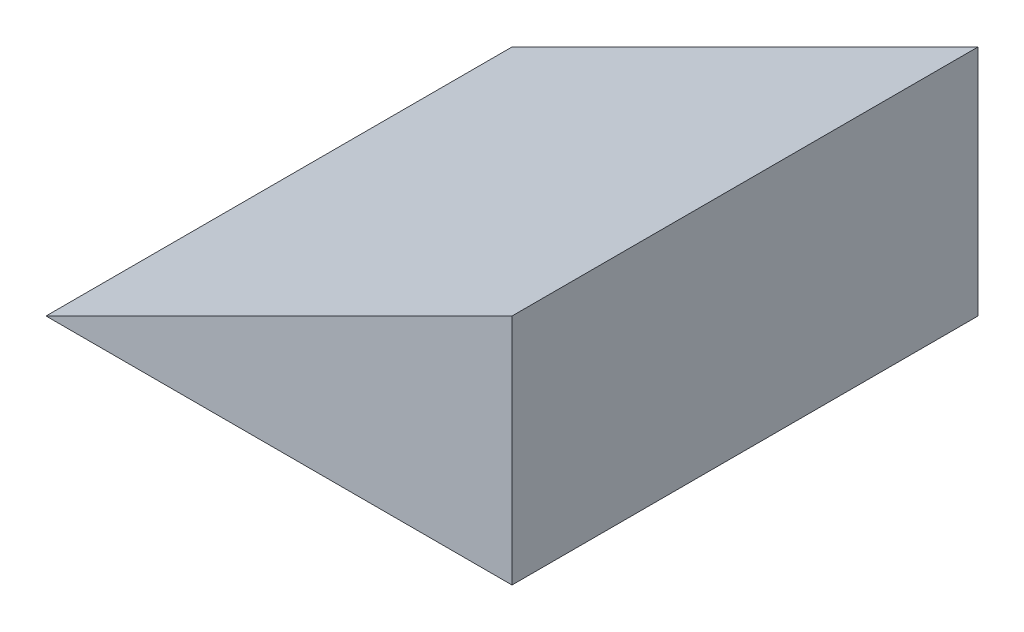
ISO-10303-21;
HEADER;
FILE_DESCRIPTION(('STEP AP214'),'2;1');
FILE_NAME('part.step','',(''),(''),'','','');
FILE_SCHEMA(('AUTOMOTIVE_DESIGN { 1 0 10303 214 1 1 1 1 }'));
ENDSEC;
DATA;
#1=APPLICATION_CONTEXT('core data for automotive mechanical design processes');
#2=APPLICATION_PROTOCOL_DEFINITION('international standard','automotive_design',2000,#1);
#3=PRODUCT_CONTEXT('',#1,'mechanical');
#4=PRODUCT('Part','Part','',(#3));
#5=PRODUCT_RELATED_PRODUCT_CATEGORY('part','',(#4));
#6=PRODUCT_DEFINITION_FORMATION('','',#4);
#7=PRODUCT_DEFINITION_CONTEXT('part definition',#1,'design');
#8=PRODUCT_DEFINITION('design','',#6,#7);
#9=PRODUCT_DEFINITION_SHAPE('','',#8);
#10=(LENGTH_UNIT() NAMED_UNIT(*) SI_UNIT(.MILLI.,.METRE.));
#11=(NAMED_UNIT(*) PLANE_ANGLE_UNIT() SI_UNIT($,.RADIAN.));
#12=(NAMED_UNIT(*) SI_UNIT($,.STERADIAN.) SOLID_ANGLE_UNIT());
#13=UNCERTAINTY_MEASURE_WITH_UNIT(LENGTH_MEASURE(1.E-05),#10,'distance_accuracy_value','');
#14=(GEOMETRIC_REPRESENTATION_CONTEXT(3) GLOBAL_UNCERTAINTY_ASSIGNED_CONTEXT((#13)) GLOBAL_UNIT_ASSIGNED_CONTEXT((#10,
#11,#12)) REPRESENTATION_CONTEXT('',''));
#15=CARTESIAN_POINT('',(0.,0.,0.));
#16=DIRECTION('',(0.,0.,1.));
#17=DIRECTION('',(1.,0.,0.));
#18=AXIS2_PLACEMENT_3D('',#15,#16,#17);
#19=CARTESIAN_POINT('',(137.354972279732,69.3037974683544,200.));
#20=DIRECTION('',(0.447213595499958,-0.894427190999916,0.));
#21=DIRECTION('',(0.894427190999916,0.447213595499958,0.));
#22=AXIS2_PLACEMENT_3D('',#19,#20,#21);
#23=PLANE('',#22);
#24=DIRECTION('',(-0.894427190999916,-0.447213595499958,0.));
#25=VECTOR('',#24,1.);
#26=CARTESIAN_POINT('',(137.354972279732,69.3037974683544,0.));
#27=LINE('',#26,#25);
#28=CARTESIAN_POINT('',(137.354972279732,69.3037974683544,0.));
#29=VERTEX_POINT('',#28);
#30=CARTESIAN_POINT('',(-62.6450277202685,-30.6962025316456,0.));
#31=VERTEX_POINT('',#30);
#32=EDGE_CURVE('E84',#29,#31,#27,.T.);
#33=ORIENTED_EDGE('',*,*,#32,.T.);
#34=DIRECTION('',(0.,0.,-1.));
#35=VECTOR('',#34,1.);
#36=CARTESIAN_POINT('',(-62.6450277202685,-30.6962025316456,200.));
#37=LINE('',#36,#35);
#38=CARTESIAN_POINT('',(-62.6450277202685,-30.6962025316456,200.));
#39=VERTEX_POINT('',#38);
#40=EDGE_CURVE('E11',#39,#31,#37,.T.);
#41=ORIENTED_EDGE('',*,*,#40,.F.);
#42=DIRECTION('',(-0.894427190999916,-0.447213595499958,0.));
#43=VECTOR('',#42,1.);
#44=CARTESIAN_POINT('',(137.354972279732,69.3037974683544,200.));
#45=LINE('',#44,#43);
#46=CARTESIAN_POINT('',(137.354972279732,69.3037974683544,200.));
#47=VERTEX_POINT('',#46);
#48=EDGE_CURVE('E77',#47,#39,#45,.T.);
#49=ORIENTED_EDGE('',*,*,#48,.F.);
#50=DIRECTION('',(0.,0.,-1.));
#51=VECTOR('',#50,1.);
#52=CARTESIAN_POINT('',(137.354972279732,69.3037974683544,200.));
#53=LINE('',#52,#51);
#54=EDGE_CURVE('E85',#47,#29,#53,.T.);
#55=ORIENTED_EDGE('',*,*,#54,.T.);
#56=EDGE_LOOP('',(#33,#41,#49,#55));
#57=FACE_BOUND('',#56,.T.);
#58=ADVANCED_FACE('F37',(#57),#23,.F.);
#59=CARTESIAN_POINT('',(-62.6450277202685,-30.6962025316456,200.));
#60=DIRECTION('',(0.,1.,0.));
#61=DIRECTION('',(0.,0.,1.));
#62=AXIS2_PLACEMENT_3D('',#59,#60,#61);
#63=PLANE('',#62);
#64=DIRECTION('',(1.,0.,0.));
#65=VECTOR('',#64,1.);
#66=CARTESIAN_POINT('',(-62.6450277202685,-30.6962025316456,0.));
#67=LINE('',#66,#65);
#68=CARTESIAN_POINT('',(137.354972279732,-30.6962025316456,0.));
#69=VERTEX_POINT('',#68);
#70=EDGE_CURVE('E65',#31,#69,#67,.T.);
#71=ORIENTED_EDGE('',*,*,#70,.T.);
#72=DIRECTION('',(0.,0.,-1.));
#73=VECTOR('',#72,1.);
#74=CARTESIAN_POINT('',(137.354972279732,-30.6962025316456,200.));
#75=LINE('',#74,#73);
#76=CARTESIAN_POINT('',(137.354972279732,-30.6962025316456,200.));
#77=VERTEX_POINT('',#76);
#78=EDGE_CURVE('E45',#77,#69,#75,.T.);
#79=ORIENTED_EDGE('',*,*,#78,.F.);
#80=DIRECTION('',(1.,0.,0.));
#81=VECTOR('',#80,1.);
#82=CARTESIAN_POINT('',(-62.6450277202685,-30.6962025316456,200.));
#83=LINE('',#82,#81);
#84=EDGE_CURVE('E73',#39,#77,#83,.T.);
#85=ORIENTED_EDGE('',*,*,#84,.F.);
#86=ORIENTED_EDGE('',*,*,#40,.T.);
#87=EDGE_LOOP('',(#71,#79,#85,#86));
#88=FACE_BOUND('',#87,.T.);
#89=ADVANCED_FACE('F74',(#88),#63,.F.);
#90=CARTESIAN_POINT('',(137.354972279732,-30.6962025316456,200.));
#91=DIRECTION('',(-1.,0.,0.));
#92=DIRECTION('',(0.,0.,1.));
#93=AXIS2_PLACEMENT_3D('',#90,#91,#92);
#94=PLANE('',#93);
#95=DIRECTION('',(0.,1.,0.));
#96=VECTOR('',#95,1.);
#97=CARTESIAN_POINT('',(137.354972279732,-30.6962025316456,0.));
#98=LINE('',#97,#96);
#99=EDGE_CURVE('E70',#69,#29,#98,.T.);
#100=ORIENTED_EDGE('',*,*,#99,.T.);
#101=ORIENTED_EDGE('',*,*,#54,.F.);
#102=DIRECTION('',(0.,1.,0.));
#103=VECTOR('',#102,1.);
#104=CARTESIAN_POINT('',(137.354972279732,-30.6962025316456,200.));
#105=LINE('',#104,#103);
#106=EDGE_CURVE('E53',#77,#47,#105,.T.);
#107=ORIENTED_EDGE('',*,*,#106,.F.);
#108=ORIENTED_EDGE('',*,*,#78,.T.);
#109=EDGE_LOOP('',(#100,#101,#107,#108));
#110=FACE_BOUND('',#109,.T.);
#111=ADVANCED_FACE('F92',(#110),#94,.F.);
#112=CARTESIAN_POINT('',(0.,0.,200.));
#113=DIRECTION('',(0.,0.,-1.));
#114=DIRECTION('',(-1.,0.,0.));
#115=AXIS2_PLACEMENT_3D('',#112,#113,#114);
#116=PLANE('',#115);
#117=ORIENTED_EDGE('',*,*,#48,.T.);
#118=ORIENTED_EDGE('',*,*,#84,.T.);
#119=ORIENTED_EDGE('',*,*,#106,.T.);
#120=EDGE_LOOP('',(#117,#118,#119));
#121=FACE_BOUND('',#120,.T.);
#122=ADVANCED_FACE('F80',(#121),#116,.F.);
#123=CARTESIAN_POINT('',(0.,0.,0.));
#124=DIRECTION('',(0.,0.,-1.));
#125=DIRECTION('',(-1.,0.,0.));
#126=AXIS2_PLACEMENT_3D('',#123,#124,#125);
#127=PLANE('',#126);
#128=ORIENTED_EDGE('',*,*,#32,.F.);
#129=ORIENTED_EDGE('',*,*,#99,.F.);
#130=ORIENTED_EDGE('',*,*,#70,.F.);
#131=EDGE_LOOP('',(#128,#129,#130));
#132=FACE_BOUND('',#131,.T.);
#133=ADVANCED_FACE('F93',(#132),#127,.T.);
#134=CLOSED_SHELL('',(#58,#89,#111,#122,#133));
#135=MANIFOLD_SOLID_BREP('B2',#134);
#136=ADVANCED_BREP_SHAPE_REPRESENTATION('',(#18,#135),#14);
#137=SHAPE_DEFINITION_REPRESENTATION(#9,#136);
ENDSEC;
END-ISO-10303-21;
